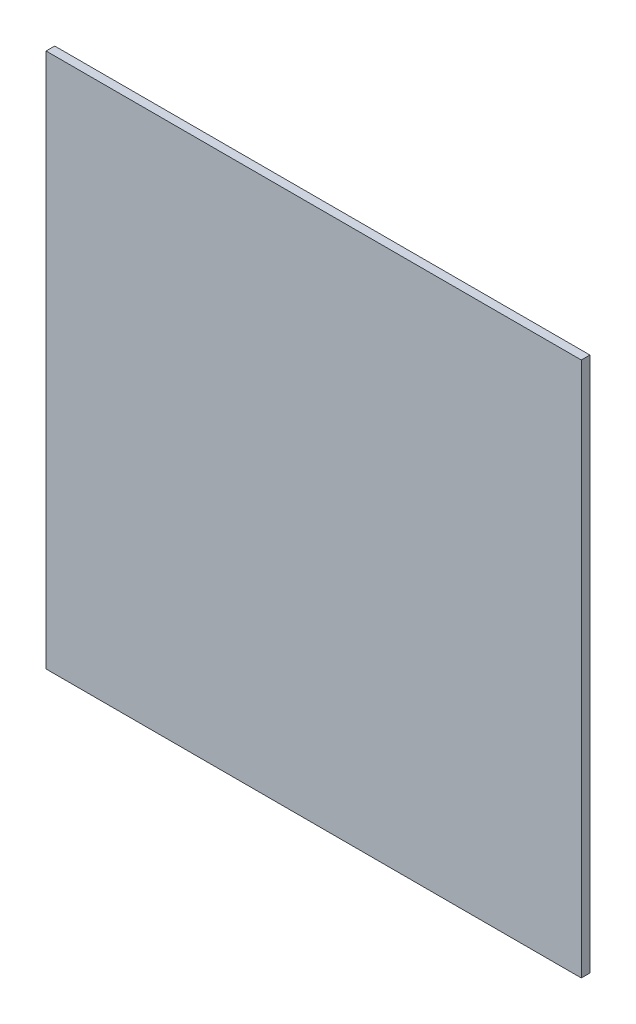
ISO-10303-21;
HEADER;
FILE_DESCRIPTION(('STEP AP214'),'2;1');
FILE_NAME('part.step','',(''),(''),'','','');
FILE_SCHEMA(('AUTOMOTIVE_DESIGN { 1 0 10303 214 1 1 1 1 }'));
ENDSEC;
DATA;
#1=APPLICATION_CONTEXT('core data for automotive mechanical design processes');
#2=APPLICATION_PROTOCOL_DEFINITION('international standard','automotive_design',2000,#1);
#3=PRODUCT_CONTEXT('',#1,'mechanical');
#4=PRODUCT('Part','Part','',(#3));
#5=PRODUCT_RELATED_PRODUCT_CATEGORY('part','',(#4));
#6=PRODUCT_DEFINITION_FORMATION('','',#4);
#7=PRODUCT_DEFINITION_CONTEXT('part definition',#1,'design');
#8=PRODUCT_DEFINITION('design','',#6,#7);
#9=PRODUCT_DEFINITION_SHAPE('','',#8);
#10=(LENGTH_UNIT() NAMED_UNIT(*) SI_UNIT(.MILLI.,.METRE.));
#11=(NAMED_UNIT(*) PLANE_ANGLE_UNIT() SI_UNIT($,.RADIAN.));
#12=(NAMED_UNIT(*) SI_UNIT($,.STERADIAN.) SOLID_ANGLE_UNIT());
#13=UNCERTAINTY_MEASURE_WITH_UNIT(LENGTH_MEASURE(1.E-05),#10,'distance_accuracy_value','');
#14=(GEOMETRIC_REPRESENTATION_CONTEXT(3) GLOBAL_UNCERTAINTY_ASSIGNED_CONTEXT((#13)) GLOBAL_UNIT_ASSIGNED_CONTEXT((#10,
#11,#12)) REPRESENTATION_CONTEXT('',''));
#15=CARTESIAN_POINT('',(0.,0.,0.));
#16=DIRECTION('',(0.,0.,1.));
#17=DIRECTION('',(1.,0.,0.));
#18=AXIS2_PLACEMENT_3D('',#15,#16,#17);
#19=CARTESIAN_POINT('',(0.,0.,10.));
#20=DIRECTION('',(1.,0.,0.));
#21=DIRECTION('',(0.,1.,0.));
#22=AXIS2_PLACEMENT_3D('',#19,#20,#21);
#23=PLANE('',#22);
#24=DIRECTION('',(0.,-1.,0.));
#25=VECTOR('',#24,1.);
#26=CARTESIAN_POINT('',(0.,0.,0.));
#27=LINE('',#26,#25);
#28=CARTESIAN_POINT('',(-3.33066907387547E-13,620.,0.));
#29=VERTEX_POINT('',#28);
#30=CARTESIAN_POINT('',(0.,0.,0.));
#31=VERTEX_POINT('',#30);
#32=EDGE_CURVE('E106',#29,#31,#27,.T.);
#33=ORIENTED_EDGE('',*,*,#32,.T.);
#34=DIRECTION('',(0.,0.,-1.));
#35=VECTOR('',#34,1.);
#36=CARTESIAN_POINT('',(0.,0.,10.));
#37=LINE('',#36,#35);
#38=CARTESIAN_POINT('',(0.,0.,10.));
#39=VERTEX_POINT('',#38);
#40=EDGE_CURVE('E11',#39,#31,#37,.T.);
#41=ORIENTED_EDGE('',*,*,#40,.F.);
#42=DIRECTION('',(0.,-1.,0.));
#43=VECTOR('',#42,1.);
#44=CARTESIAN_POINT('',(0.,0.,10.));
#45=LINE('',#44,#43);
#46=CARTESIAN_POINT('',(-3.33066907387547E-13,620.,10.));
#47=VERTEX_POINT('',#46);
#48=EDGE_CURVE('E94',#47,#39,#45,.T.);
#49=ORIENTED_EDGE('',*,*,#48,.F.);
#50=DIRECTION('',(0.,0.,-1.));
#51=VECTOR('',#50,1.);
#52=CARTESIAN_POINT('',(-3.33066907387547E-13,620.,10.));
#53=LINE('',#52,#51);
#54=EDGE_CURVE('E102',#47,#29,#53,.T.);
#55=ORIENTED_EDGE('',*,*,#54,.T.);
#56=EDGE_LOOP('',(#33,#41,#49,#55));
#57=FACE_BOUND('',#56,.T.);
#58=ADVANCED_FACE('F43',(#57),#23,.F.);
#59=CARTESIAN_POINT('',(0.,0.,10.));
#60=DIRECTION('',(0.,1.,0.));
#61=DIRECTION('',(0.,0.,1.));
#62=AXIS2_PLACEMENT_3D('',#59,#60,#61);
#63=PLANE('',#62);
#64=DIRECTION('',(1.,0.,0.));
#65=VECTOR('',#64,1.);
#66=CARTESIAN_POINT('',(0.,0.,0.));
#67=LINE('',#66,#65);
#68=CARTESIAN_POINT('',(620.,0.,0.));
#69=VERTEX_POINT('',#68);
#70=EDGE_CURVE('E98',#31,#69,#67,.T.);
#71=ORIENTED_EDGE('',*,*,#70,.T.);
#72=DIRECTION('',(0.,0.,-1.));
#73=VECTOR('',#72,1.);
#74=CARTESIAN_POINT('',(620.,0.,10.));
#75=LINE('',#74,#73);
#76=CARTESIAN_POINT('',(620.,0.,10.));
#77=VERTEX_POINT('',#76);
#78=EDGE_CURVE('E51',#77,#69,#75,.T.);
#79=ORIENTED_EDGE('',*,*,#78,.F.);
#80=DIRECTION('',(1.,0.,0.));
#81=VECTOR('',#80,1.);
#82=CARTESIAN_POINT('',(0.,0.,10.));
#83=LINE('',#82,#81);
#84=EDGE_CURVE('E89',#39,#77,#83,.T.);
#85=ORIENTED_EDGE('',*,*,#84,.F.);
#86=ORIENTED_EDGE('',*,*,#40,.T.);
#87=EDGE_LOOP('',(#71,#79,#85,#86));
#88=FACE_BOUND('',#87,.T.);
#89=ADVANCED_FACE('F97',(#88),#63,.F.);
#90=CARTESIAN_POINT('',(620.,0.,10.));
#91=DIRECTION('',(-1.,0.,0.));
#92=DIRECTION('',(0.,-1.,0.));
#93=AXIS2_PLACEMENT_3D('',#90,#91,#92);
#94=PLANE('',#93);
#95=DIRECTION('',(0.,1.,0.));
#96=VECTOR('',#95,1.);
#97=CARTESIAN_POINT('',(620.,0.,0.));
#98=LINE('',#97,#96);
#99=CARTESIAN_POINT('',(620.,620.,0.));
#100=VERTEX_POINT('',#99);
#101=EDGE_CURVE('E76',#69,#100,#98,.T.);
#102=ORIENTED_EDGE('',*,*,#101,.T.);
#103=DIRECTION('',(0.,0.,-1.));
#104=VECTOR('',#103,1.);
#105=CARTESIAN_POINT('',(620.,620.,10.));
#106=LINE('',#105,#104);
#107=CARTESIAN_POINT('',(620.,620.,10.));
#108=VERTEX_POINT('',#107);
#109=EDGE_CURVE('E99',#108,#100,#106,.T.);
#110=ORIENTED_EDGE('',*,*,#109,.F.);
#111=DIRECTION('',(0.,1.,0.));
#112=VECTOR('',#111,1.);
#113=CARTESIAN_POINT('',(620.,0.,10.));
#114=LINE('',#113,#112);
#115=EDGE_CURVE('E92',#77,#108,#114,.T.);
#116=ORIENTED_EDGE('',*,*,#115,.F.);
#117=ORIENTED_EDGE('',*,*,#78,.T.);
#118=EDGE_LOOP('',(#102,#110,#116,#117));
#119=FACE_BOUND('',#118,.T.);
#120=ADVANCED_FACE('F100',(#119),#94,.F.);
#121=CARTESIAN_POINT('',(-3.33066907387547E-13,620.,10.));
#122=DIRECTION('',(0.,-1.,0.));
#123=DIRECTION('',(0.,0.,-1.));
#124=AXIS2_PLACEMENT_3D('',#121,#122,#123);
#125=PLANE('',#124);
#126=DIRECTION('',(-1.,0.,0.));
#127=VECTOR('',#126,1.);
#128=CARTESIAN_POINT('',(-3.33066907387547E-13,620.,0.));
#129=LINE('',#128,#127);
#130=EDGE_CURVE('E82',#100,#29,#129,.T.);
#131=ORIENTED_EDGE('',*,*,#130,.T.);
#132=ORIENTED_EDGE('',*,*,#54,.F.);
#133=DIRECTION('',(-1.,0.,0.));
#134=VECTOR('',#133,1.);
#135=CARTESIAN_POINT('',(-3.33066907387547E-13,620.,10.));
#136=LINE('',#135,#134);
#137=EDGE_CURVE('E59',#108,#47,#136,.T.);
#138=ORIENTED_EDGE('',*,*,#137,.F.);
#139=ORIENTED_EDGE('',*,*,#109,.T.);
#140=EDGE_LOOP('',(#131,#132,#138,#139));
#141=FACE_BOUND('',#140,.T.);
#142=ADVANCED_FACE('F113',(#141),#125,.F.);
#143=CARTESIAN_POINT('',(0.,0.,10.));
#144=DIRECTION('',(0.,0.,-1.));
#145=DIRECTION('',(-1.,0.,0.));
#146=AXIS2_PLACEMENT_3D('',#143,#144,#145);
#147=PLANE('',#146);
#148=ORIENTED_EDGE('',*,*,#48,.T.);
#149=ORIENTED_EDGE('',*,*,#84,.T.);
#150=ORIENTED_EDGE('',*,*,#115,.T.);
#151=ORIENTED_EDGE('',*,*,#137,.T.);
#152=EDGE_LOOP('',(#148,#149,#150,#151));
#153=FACE_BOUND('',#152,.T.);
#154=ADVANCED_FACE('F90',(#153),#147,.F.);
#155=CARTESIAN_POINT('',(0.,0.,0.));
#156=DIRECTION('',(0.,0.,-1.));
#157=DIRECTION('',(-1.,0.,0.));
#158=AXIS2_PLACEMENT_3D('',#155,#156,#157);
#159=PLANE('',#158);
#160=ORIENTED_EDGE('',*,*,#32,.F.);
#161=ORIENTED_EDGE('',*,*,#130,.F.);
#162=ORIENTED_EDGE('',*,*,#101,.F.);
#163=ORIENTED_EDGE('',*,*,#70,.F.);
#164=EDGE_LOOP('',(#160,#161,#162,#163));
#165=FACE_BOUND('',#164,.T.);
#166=ADVANCED_FACE('F116',(#165),#159,.T.);
#167=CLOSED_SHELL('',(#58,#89,#120,#142,#154,#166));
#168=MANIFOLD_SOLID_BREP('B2',#167);
#169=ADVANCED_BREP_SHAPE_REPRESENTATION('',(#18,#168),#14);
#170=SHAPE_DEFINITION_REPRESENTATION(#9,#169);
ENDSEC;
END-ISO-10303-21;
